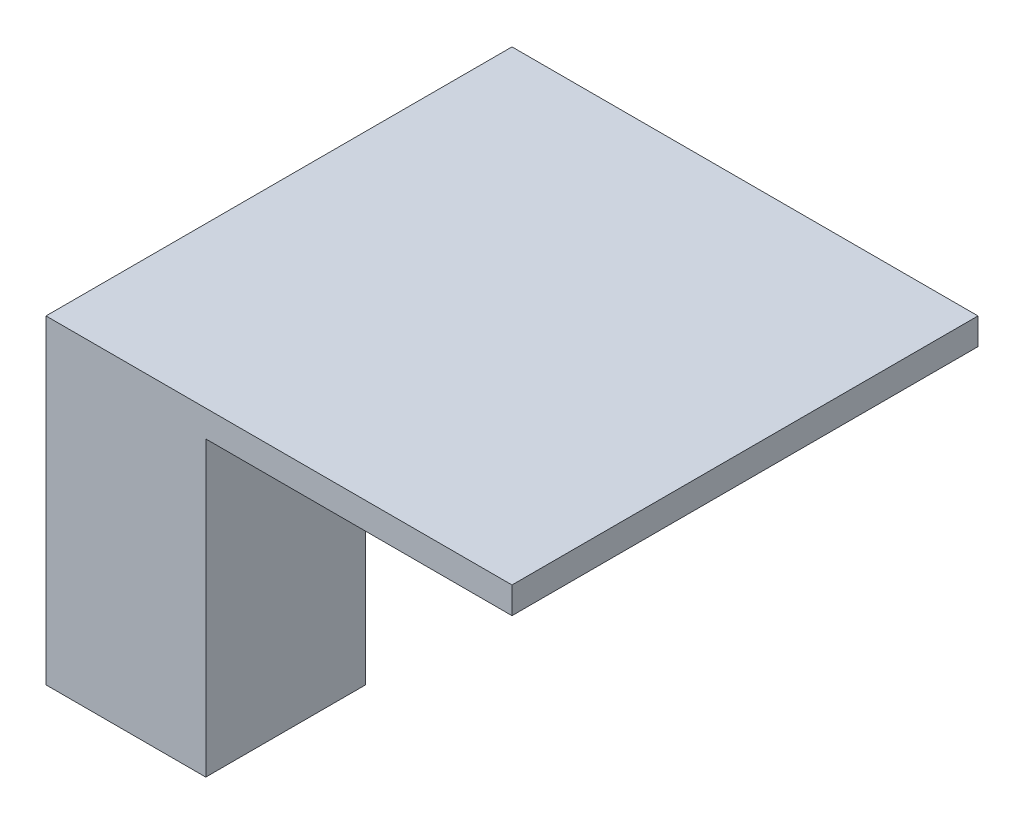
ISO-10303-21;
HEADER;
FILE_DESCRIPTION(('STEP AP214'),'2;1');
FILE_NAME('part.step','',(''),(''),'','','');
FILE_SCHEMA(('AUTOMOTIVE_DESIGN { 1 0 10303 214 1 1 1 1 }'));
ENDSEC;
DATA;
#1=APPLICATION_CONTEXT('core data for automotive mechanical design processes');
#2=APPLICATION_PROTOCOL_DEFINITION('international standard','automotive_design',2000,#1);
#3=PRODUCT_CONTEXT('',#1,'mechanical');
#4=PRODUCT('Part','Part','',(#3));
#5=PRODUCT_RELATED_PRODUCT_CATEGORY('part','',(#4));
#6=PRODUCT_DEFINITION_FORMATION('','',#4);
#7=PRODUCT_DEFINITION_CONTEXT('part definition',#1,'design');
#8=PRODUCT_DEFINITION('design','',#6,#7);
#9=PRODUCT_DEFINITION_SHAPE('','',#8);
#10=(LENGTH_UNIT() NAMED_UNIT(*) SI_UNIT(.MILLI.,.METRE.));
#11=(NAMED_UNIT(*) PLANE_ANGLE_UNIT() SI_UNIT($,.RADIAN.));
#12=(NAMED_UNIT(*) SI_UNIT($,.STERADIAN.) SOLID_ANGLE_UNIT());
#13=UNCERTAINTY_MEASURE_WITH_UNIT(LENGTH_MEASURE(1.E-05),#10,'distance_accuracy_value','');
#14=(GEOMETRIC_REPRESENTATION_CONTEXT(3) GLOBAL_UNCERTAINTY_ASSIGNED_CONTEXT((#13)) GLOBAL_UNIT_ASSIGNED_CONTEXT((#10,
#11,#12)) REPRESENTATION_CONTEXT('',''));
#15=CARTESIAN_POINT('',(0.,0.,0.));
#16=DIRECTION('',(0.,0.,1.));
#17=DIRECTION('',(1.,0.,0.));
#18=AXIS2_PLACEMENT_3D('',#15,#16,#17);
#19=CARTESIAN_POINT('',(0.,22.,0.));
#20=DIRECTION('',(1.,0.,0.));
#21=DIRECTION('',(0.,0.,-1.));
#22=AXIS2_PLACEMENT_3D('',#19,#20,#21);
#23=PLANE('',#22);
#24=DIRECTION('',(0.,0.,1.));
#25=VECTOR('',#24,1.);
#26=CARTESIAN_POINT('',(0.,0.,0.));
#27=LINE('',#26,#25);
#28=CARTESIAN_POINT('',(0.,0.,-12.));
#29=VERTEX_POINT('',#28);
#30=CARTESIAN_POINT('',(0.,0.,0.));
#31=VERTEX_POINT('',#30);
#32=EDGE_CURVE('E82',#29,#31,#27,.T.);
#33=ORIENTED_EDGE('',*,*,#32,.T.);
#34=DIRECTION('',(0.,-1.,0.));
#35=VECTOR('',#34,1.);
#36=CARTESIAN_POINT('',(0.,22.,0.));
#37=LINE('',#36,#35);
#38=CARTESIAN_POINT('',(0.,24.,0.));
#39=VERTEX_POINT('',#38);
#40=EDGE_CURVE('E11',#39,#31,#37,.T.);
#41=ORIENTED_EDGE('',*,*,#40,.F.);
#42=DIRECTION('',(0.,0.,1.));
#43=VECTOR('',#42,1.);
#44=CARTESIAN_POINT('',(0.,24.,0.));
#45=LINE('',#44,#43);
#46=CARTESIAN_POINT('',(0.,24.,-35.));
#47=VERTEX_POINT('',#46);
#48=EDGE_CURVE('E116',#47,#39,#45,.T.);
#49=ORIENTED_EDGE('',*,*,#48,.F.);
#50=DIRECTION('',(0.,-1.,0.));
#51=VECTOR('',#50,1.);
#52=CARTESIAN_POINT('',(0.,24.,-35.));
#53=LINE('',#52,#51);
#54=CARTESIAN_POINT('',(0.,22.,-35.));
#55=VERTEX_POINT('',#54);
#56=EDGE_CURVE('E148',#47,#55,#53,.T.);
#57=ORIENTED_EDGE('',*,*,#56,.T.);
#58=DIRECTION('',(0.,0.,1.));
#59=VECTOR('',#58,1.);
#60=CARTESIAN_POINT('',(0.,22.,0.));
#61=LINE('',#60,#59);
#62=CARTESIAN_POINT('',(0.,22.,-12.));
#63=VERTEX_POINT('',#62);
#64=EDGE_CURVE('E85',#55,#63,#61,.T.);
#65=ORIENTED_EDGE('',*,*,#64,.T.);
#66=DIRECTION('',(0.,-1.,0.));
#67=VECTOR('',#66,1.);
#68=CARTESIAN_POINT('',(0.,22.,-12.));
#69=LINE('',#68,#67);
#70=EDGE_CURVE('E72',#63,#29,#69,.T.);
#71=ORIENTED_EDGE('',*,*,#70,.T.);
#72=EDGE_LOOP('',(#33,#41,#49,#57,#65,#71));
#73=FACE_BOUND('',#72,.T.);
#74=ADVANCED_FACE('F33',(#73),#23,.F.);
#75=CARTESIAN_POINT('',(0.,22.,0.));
#76=DIRECTION('',(0.,0.,-1.));
#77=DIRECTION('',(-1.,0.,0.));
#78=AXIS2_PLACEMENT_3D('',#75,#76,#77);
#79=PLANE('',#78);
#80=DIRECTION('',(1.,0.,0.));
#81=VECTOR('',#80,1.);
#82=CARTESIAN_POINT('',(0.,0.,0.));
#83=LINE('',#82,#81);
#84=CARTESIAN_POINT('',(12.,0.,0.));
#85=VERTEX_POINT('',#84);
#86=EDGE_CURVE('E89',#31,#85,#83,.T.);
#87=ORIENTED_EDGE('',*,*,#86,.T.);
#88=DIRECTION('',(0.,-1.,0.));
#89=VECTOR('',#88,1.);
#90=CARTESIAN_POINT('',(12.,22.,0.));
#91=LINE('',#90,#89);
#92=CARTESIAN_POINT('',(12.,22.,0.));
#93=VERTEX_POINT('',#92);
#94=EDGE_CURVE('E41',#93,#85,#91,.T.);
#95=ORIENTED_EDGE('',*,*,#94,.F.);
#96=DIRECTION('',(1.,0.,0.));
#97=VECTOR('',#96,1.);
#98=CARTESIAN_POINT('',(0.,22.,0.));
#99=LINE('',#98,#97);
#100=CARTESIAN_POINT('',(35.,22.,0.));
#101=VERTEX_POINT('',#100);
#102=EDGE_CURVE('E108',#93,#101,#99,.T.);
#103=ORIENTED_EDGE('',*,*,#102,.T.);
#104=DIRECTION('',(0.,-1.,0.));
#105=VECTOR('',#104,1.);
#106=CARTESIAN_POINT('',(35.,24.,0.));
#107=LINE('',#106,#105);
#108=CARTESIAN_POINT('',(35.,24.,0.));
#109=VERTEX_POINT('',#108);
#110=EDGE_CURVE('E90',#109,#101,#107,.T.);
#111=ORIENTED_EDGE('',*,*,#110,.F.);
#112=DIRECTION('',(1.,0.,0.));
#113=VECTOR('',#112,1.);
#114=CARTESIAN_POINT('',(0.,24.,0.));
#115=LINE('',#114,#113);
#116=EDGE_CURVE('E112',#39,#109,#115,.T.);
#117=ORIENTED_EDGE('',*,*,#116,.F.);
#118=ORIENTED_EDGE('',*,*,#40,.T.);
#119=EDGE_LOOP('',(#87,#95,#103,#111,#117,#118));
#120=FACE_BOUND('',#119,.T.);
#121=ADVANCED_FACE('F105',(#120),#79,.F.);
#122=CARTESIAN_POINT('',(12.,22.,0.));
#123=DIRECTION('',(-1.,0.,0.));
#124=DIRECTION('',(0.,0.,1.));
#125=AXIS2_PLACEMENT_3D('',#122,#123,#124);
#126=PLANE('',#125);
#127=DIRECTION('',(0.,0.,-1.));
#128=VECTOR('',#127,1.);
#129=CARTESIAN_POINT('',(12.,0.,0.));
#130=LINE('',#129,#128);
#131=CARTESIAN_POINT('',(12.,0.,-12.));
#132=VERTEX_POINT('',#131);
#133=EDGE_CURVE('E64',#85,#132,#130,.T.);
#134=ORIENTED_EDGE('',*,*,#133,.T.);
#135=DIRECTION('',(0.,-1.,0.));
#136=VECTOR('',#135,1.);
#137=CARTESIAN_POINT('',(12.,22.,-12.));
#138=LINE('',#137,#136);
#139=CARTESIAN_POINT('',(12.,22.,-12.));
#140=VERTEX_POINT('',#139);
#141=EDGE_CURVE('E49',#140,#132,#138,.T.);
#142=ORIENTED_EDGE('',*,*,#141,.F.);
#143=DIRECTION('',(0.,0.,-1.));
#144=VECTOR('',#143,1.);
#145=CARTESIAN_POINT('',(12.,22.,0.));
#146=LINE('',#145,#144);
#147=EDGE_CURVE('E76',#93,#140,#146,.T.);
#148=ORIENTED_EDGE('',*,*,#147,.F.);
#149=ORIENTED_EDGE('',*,*,#94,.T.);
#150=EDGE_LOOP('',(#134,#142,#148,#149));
#151=FACE_BOUND('',#150,.T.);
#152=ADVANCED_FACE('F100',(#151),#126,.F.);
#153=CARTESIAN_POINT('',(0.,22.,-12.));
#154=DIRECTION('',(0.,0.,1.));
#155=DIRECTION('',(1.,0.,0.));
#156=AXIS2_PLACEMENT_3D('',#153,#154,#155);
#157=PLANE('',#156);
#158=DIRECTION('',(-1.,0.,0.));
#159=VECTOR('',#158,1.);
#160=CARTESIAN_POINT('',(0.,0.,-12.));
#161=LINE('',#160,#159);
#162=EDGE_CURVE('E69',#132,#29,#161,.T.);
#163=ORIENTED_EDGE('',*,*,#162,.T.);
#164=ORIENTED_EDGE('',*,*,#70,.F.);
#165=DIRECTION('',(-1.,0.,0.));
#166=VECTOR('',#165,1.);
#167=CARTESIAN_POINT('',(0.,22.,-12.));
#168=LINE('',#167,#166);
#169=EDGE_CURVE('E86',#140,#63,#168,.T.);
#170=ORIENTED_EDGE('',*,*,#169,.F.);
#171=ORIENTED_EDGE('',*,*,#141,.T.);
#172=EDGE_LOOP('',(#163,#164,#170,#171));
#173=FACE_BOUND('',#172,.T.);
#174=ADVANCED_FACE('F71',(#173),#157,.F.);
#175=CARTESIAN_POINT('',(0.,0.,0.));
#176=DIRECTION('',(0.,-1.,0.));
#177=DIRECTION('',(0.,0.,-1.));
#178=AXIS2_PLACEMENT_3D('',#175,#176,#177);
#179=PLANE('',#178);
#180=ORIENTED_EDGE('',*,*,#32,.F.);
#181=ORIENTED_EDGE('',*,*,#162,.F.);
#182=ORIENTED_EDGE('',*,*,#133,.F.);
#183=ORIENTED_EDGE('',*,*,#86,.F.);
#184=EDGE_LOOP('',(#180,#181,#182,#183));
#185=FACE_BOUND('',#184,.T.);
#186=ADVANCED_FACE('F88',(#185),#179,.T.);
#187=CARTESIAN_POINT('',(35.,24.,0.));
#188=DIRECTION('',(-1.,0.,0.));
#189=DIRECTION('',(0.,0.,1.));
#190=AXIS2_PLACEMENT_3D('',#187,#188,#189);
#191=PLANE('',#190);
#192=DIRECTION('',(0.,0.,-1.));
#193=VECTOR('',#192,1.);
#194=CARTESIAN_POINT('',(35.,22.,0.));
#195=LINE('',#194,#193);
#196=CARTESIAN_POINT('',(35.,22.,-35.));
#197=VERTEX_POINT('',#196);
#198=EDGE_CURVE('E135',#101,#197,#195,.T.);
#199=ORIENTED_EDGE('',*,*,#198,.T.);
#200=DIRECTION('',(0.,-1.,0.));
#201=VECTOR('',#200,1.);
#202=CARTESIAN_POINT('',(35.,24.,-35.));
#203=LINE('',#202,#201);
#204=CARTESIAN_POINT('',(35.,24.,-35.));
#205=VERTEX_POINT('',#204);
#206=EDGE_CURVE('E94',#205,#197,#203,.T.);
#207=ORIENTED_EDGE('',*,*,#206,.F.);
#208=DIRECTION('',(0.,0.,-1.));
#209=VECTOR('',#208,1.);
#210=CARTESIAN_POINT('',(35.,24.,0.));
#211=LINE('',#210,#209);
#212=EDGE_CURVE('E158',#109,#205,#211,.T.);
#213=ORIENTED_EDGE('',*,*,#212,.F.);
#214=ORIENTED_EDGE('',*,*,#110,.T.);
#215=EDGE_LOOP('',(#199,#207,#213,#214));
#216=FACE_BOUND('',#215,.T.);
#217=ADVANCED_FACE('F137',(#216),#191,.F.);
#218=CARTESIAN_POINT('',(0.,24.,-35.));
#219=DIRECTION('',(0.,0.,1.));
#220=DIRECTION('',(1.,0.,0.));
#221=AXIS2_PLACEMENT_3D('',#218,#219,#220);
#222=PLANE('',#221);
#223=DIRECTION('',(-1.,0.,0.));
#224=VECTOR('',#223,1.);
#225=CARTESIAN_POINT('',(0.,22.,-35.));
#226=LINE('',#225,#224);
#227=EDGE_CURVE('E142',#197,#55,#226,.T.);
#228=ORIENTED_EDGE('',*,*,#227,.T.);
#229=ORIENTED_EDGE('',*,*,#56,.F.);
#230=DIRECTION('',(-1.,0.,0.));
#231=VECTOR('',#230,1.);
#232=CARTESIAN_POINT('',(0.,24.,-35.));
#233=LINE('',#232,#231);
#234=EDGE_CURVE('E147',#205,#47,#233,.T.);
#235=ORIENTED_EDGE('',*,*,#234,.F.);
#236=ORIENTED_EDGE('',*,*,#206,.T.);
#237=EDGE_LOOP('',(#228,#229,#235,#236));
#238=FACE_BOUND('',#237,.T.);
#239=ADVANCED_FACE('F145',(#238),#222,.F.);
#240=CARTESIAN_POINT('',(0.,24.,0.));
#241=DIRECTION('',(0.,-1.,0.));
#242=DIRECTION('',(0.,0.,-1.));
#243=AXIS2_PLACEMENT_3D('',#240,#241,#242);
#244=PLANE('',#243);
#245=ORIENTED_EDGE('',*,*,#48,.T.);
#246=ORIENTED_EDGE('',*,*,#116,.T.);
#247=ORIENTED_EDGE('',*,*,#212,.T.);
#248=ORIENTED_EDGE('',*,*,#234,.T.);
#249=EDGE_LOOP('',(#245,#246,#247,#248));
#250=FACE_BOUND('',#249,.T.);
#251=ADVANCED_FACE('F161',(#250),#244,.F.);
#252=CARTESIAN_POINT('',(0.,22.,0.));
#253=DIRECTION('',(0.,-1.,0.));
#254=DIRECTION('',(0.,0.,-1.));
#255=AXIS2_PLACEMENT_3D('',#252,#253,#254);
#256=PLANE('',#255);
#257=ORIENTED_EDGE('',*,*,#102,.F.);
#258=ORIENTED_EDGE('',*,*,#147,.T.);
#259=ORIENTED_EDGE('',*,*,#169,.T.);
#260=ORIENTED_EDGE('',*,*,#64,.F.);
#261=ORIENTED_EDGE('',*,*,#227,.F.);
#262=ORIENTED_EDGE('',*,*,#198,.F.);
#263=EDGE_LOOP('',(#257,#258,#259,#260,#261,#262));
#264=FACE_BOUND('',#263,.T.);
#265=ADVANCED_FACE('F150',(#264),#256,.T.);
#266=CLOSED_SHELL('',(#74,#121,#152,#174,#186,#217,#239,#251,#265));
#267=MANIFOLD_SOLID_BREP('B2',#266);
#268=ADVANCED_BREP_SHAPE_REPRESENTATION('',(#18,#267),#14);
#269=SHAPE_DEFINITION_REPRESENTATION(#9,#268);
ENDSEC;
END-ISO-10303-21;
